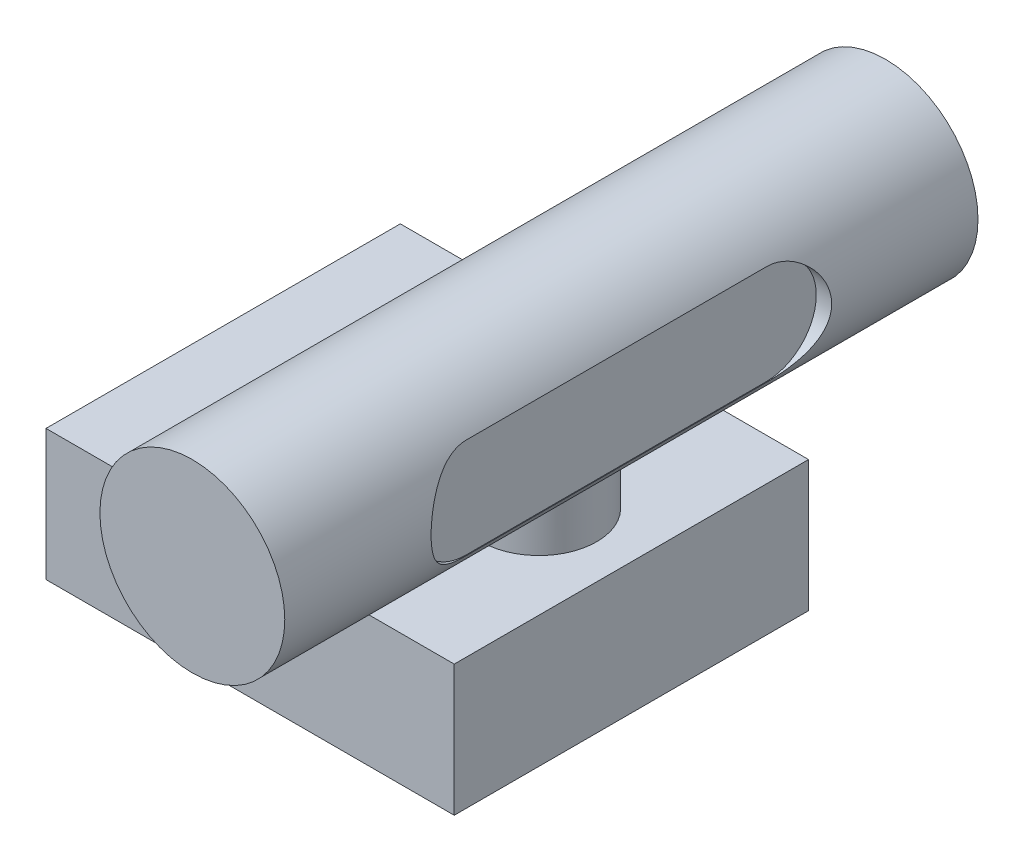
ISO-10303-21;
HEADER;
FILE_DESCRIPTION(('STEP AP214'),'2;1');
FILE_NAME('part.step','',(''),(''),'','','');
FILE_SCHEMA(('AUTOMOTIVE_DESIGN { 1 0 10303 214 1 1 1 1 }'));
ENDSEC;
DATA;
#1=APPLICATION_CONTEXT('core data for automotive mechanical design processes');
#2=APPLICATION_PROTOCOL_DEFINITION('international standard','automotive_design',2000,#1);
#3=PRODUCT_CONTEXT('',#1,'mechanical');
#4=PRODUCT('Part','Part','',(#3));
#5=PRODUCT_RELATED_PRODUCT_CATEGORY('part','',(#4));
#6=PRODUCT_DEFINITION_FORMATION('','',#4);
#7=PRODUCT_DEFINITION_CONTEXT('part definition',#1,'design');
#8=PRODUCT_DEFINITION('design','',#6,#7);
#9=PRODUCT_DEFINITION_SHAPE('','',#8);
#10=(LENGTH_UNIT() NAMED_UNIT(*) SI_UNIT(.MILLI.,.METRE.));
#11=(NAMED_UNIT(*) PLANE_ANGLE_UNIT() SI_UNIT($,.RADIAN.));
#12=(NAMED_UNIT(*) SI_UNIT($,.STERADIAN.) SOLID_ANGLE_UNIT());
#13=UNCERTAINTY_MEASURE_WITH_UNIT(LENGTH_MEASURE(1.E-05),#10,'distance_accuracy_value','');
#14=(GEOMETRIC_REPRESENTATION_CONTEXT(3) GLOBAL_UNCERTAINTY_ASSIGNED_CONTEXT((#13)) GLOBAL_UNIT_ASSIGNED_CONTEXT((#10,
#11,#12)) REPRESENTATION_CONTEXT('',''));
#15=CARTESIAN_POINT('',(0.,0.,0.));
#16=DIRECTION('',(0.,0.,1.));
#17=DIRECTION('',(1.,0.,0.));
#18=AXIS2_PLACEMENT_3D('',#15,#16,#17);
#19=CARTESIAN_POINT('',(0.,0.,45.));
#20=DIRECTION('',(0.,0.,-1.));
#21=DIRECTION('',(-1.,0.,0.));
#22=AXIS2_PLACEMENT_3D('',#19,#20,#21);
#23=CYLINDRICAL_SURFACE('',#22,12.);
#24=DIRECTION('',(0.,0.,-1.));
#25=VECTOR('',#24,1.);
#26=CARTESIAN_POINT('',(10.087120500916,-6.50000000000003,45.));
#27=LINE('',#26,#25);
#28=CARTESIAN_POINT('',(10.087120500916,-6.49999999999999,-19.5));
#29=VERTEX_POINT('',#28);
#30=CARTESIAN_POINT('',(10.087120500916,-6.5,19.5));
#31=VERTEX_POINT('',#30);
#32=EDGE_CURVE('E11',#29,#31,#27,.F.);
#33=ORIENTED_EDGE('',*,*,#32,.T.);
#34=CARTESIAN_POINT('',(10.087120500916,-6.5,19.5));
#35=CARTESIAN_POINT('',(10.087062195961,-6.50003429101187,19.6679437798922));
#36=CARTESIAN_POINT('',(10.0913128869651,-6.4934928137473,19.8358587697185));
#37=CARTESIAN_POINT('',(10.1079957775746,-6.46752293296288,20.1701586306483));
#38=CARTESIAN_POINT('',(10.1204218847057,-6.44810412578677,20.3365445476944));
#39=CARTESIAN_POINT('',(10.1529125251932,-6.39681365188614,20.6654764341207));
#40=CARTESIAN_POINT('',(10.1729259972036,-6.36502519331353,20.8280405217783));
#41=CARTESIAN_POINT('',(10.2198378122673,-6.28942794693309,21.1493435182866));
#42=CARTESIAN_POINT('',(10.2467371576266,-6.24561740912739,21.30808186658));
#43=CARTESIAN_POINT('',(10.30641682072,-6.14663265401189,21.6202942101693));
#44=CARTESIAN_POINT('',(10.3391794554295,-6.09149253336983,21.7737824255394));
#45=CARTESIAN_POINT('',(10.4096302308686,-5.97030238296009,22.0752487572257));
#46=CARTESIAN_POINT('',(10.4473202703357,-5.90424814491886,22.2232247210479));
#47=CARTESIAN_POINT('',(10.5663046508814,-5.69033017621695,22.6582627731183));
#48=CARTESIAN_POINT('',(10.6534583306845,-5.5267981501928,22.9361639977459));
#49=CARTESIAN_POINT('',(10.8437621641124,-5.14418462681988,23.4888680502809));
#50=CARTESIAN_POINT('',(10.9476439080116,-4.92125249592125,23.7607531485545));
#51=CARTESIAN_POINT('',(11.1021817500924,-4.55621786720434,24.1391432549429));
#52=CARTESIAN_POINT('',(11.1535054935014,-4.42936271280164,24.260420126194));
#53=CARTESIAN_POINT('',(11.2545808236235,-4.16584918666711,24.4926477193032));
#54=CARTESIAN_POINT('',(11.3043321637077,-4.02918928796179,24.6035968265254));
#55=CARTESIAN_POINT('',(11.4051031941459,-3.73493976173534,24.8232202801336));
#56=CARTESIAN_POINT('',(11.4558848945797,-3.57655454958828,24.9309399361234));
#57=CARTESIAN_POINT('',(11.5527946448066,-3.24991348786846,25.1324833201027));
#58=CARTESIAN_POINT('',(11.5989247072393,-3.08166195745685,25.2263130661814));
#59=CARTESIAN_POINT('',(11.6852194488674,-2.73629567186766,25.3991490337907));
#60=CARTESIAN_POINT('',(11.7253858837257,-2.55918354581627,25.47815961982));
#61=CARTESIAN_POINT('',(11.7985536228125,-2.19731412551113,25.6204241777237));
#62=CARTESIAN_POINT('',(11.8315558468563,-2.01255781632709,25.6836801724885));
#63=CARTESIAN_POINT('',(11.8870039787983,-1.65215993754409,25.7890939852802));
#64=CARTESIAN_POINT('',(11.910089170135,-1.47699526097865,25.8325472939671));
#65=CARTESIAN_POINT('',(11.9486789431556,-1.12284783377751,25.9048313956797));
#66=CARTESIAN_POINT('',(11.9641839001243,-0.943865272616932,25.9336629126088));
#67=CARTESIAN_POINT('',(11.9871523221345,-0.583712289314231,25.9762753835414));
#68=CARTESIAN_POINT('',(11.9946206025876,-0.402543243154034,25.990065350201));
#69=CARTESIAN_POINT('',(12.0013074341566,-0.0395400711660683,26.0024156424455));
#70=CARTESIAN_POINT('',(12.0005266113703,0.142294003139608,26.0009771238558));
#71=CARTESIAN_POINT('',(11.9912428191086,0.486465108070539,25.9838217733888));
#72=CARTESIAN_POINT('',(11.9835354089893,0.648899533835634,25.9695758829859));
#73=CARTESIAN_POINT('',(11.9616752161457,0.971868222053736,25.9289942657816));
#74=CARTESIAN_POINT('',(11.9475202841129,1.13240183253823,25.9026545074149));
#75=CARTESIAN_POINT('',(11.9131038825564,1.45035142395046,25.8382004725646));
#76=CARTESIAN_POINT('',(11.8928446550803,1.60776852695627,25.8000905190296));
#77=CARTESIAN_POINT('',(11.8466719124415,1.91861108230955,25.7124890255105));
#78=CARTESIAN_POINT('',(11.8207561932278,2.0720349525397,25.6629930485578));
#79=CARTESIAN_POINT('',(11.7635269793933,2.375614981164,25.5525058395535));
#80=CARTESIAN_POINT('',(11.732157367945,2.52571679943296,25.4913944136256));
#81=CARTESIAN_POINT('',(11.6648919840636,2.82013034052555,25.3585810450704));
#82=CARTESIAN_POINT('',(11.6289946923723,2.96444009830336,25.286875546223));
#83=CARTESIAN_POINT('',(11.5156113584435,3.38759401576816,25.0567278384945));
#84=CARTESIAN_POINT('',(11.4323977807755,3.65684690787994,24.8831867352693));
#85=CARTESIAN_POINT('',(11.2478737696275,4.1921084349449,24.4799712367777));
#86=CARTESIAN_POINT('',(11.1455802380817,4.45477024563127,24.2463038361287));
#87=CARTESIAN_POINT('',(10.9911726506922,4.81783578518724,23.8668304661678));
#88=CARTESIAN_POINT('',(10.9394942674054,4.93379547102318,23.7353763681101));
#89=CARTESIAN_POINT('',(10.8370445335834,5.15492882106028,23.4632602351618));
#90=CARTESIAN_POINT('',(10.786273344103,5.26010058548042,23.3225965855663));
#91=CARTESIAN_POINT('',(10.68275936451,5.46746786156484,23.0203931283512));
#92=CARTESIAN_POINT('',(10.6302136391154,5.56865733060802,22.8580941647339));
#93=CARTESIAN_POINT('',(10.5295140226574,5.7567974188211,22.5242310177048));
#94=CARTESIAN_POINT('',(10.4813581259231,5.84375455520089,22.3526711231499));
#95=CARTESIAN_POINT('',(10.3912927596917,6.00244504716518,22.0015379832887));
#96=CARTESIAN_POINT('',(10.3493697933328,6.07421144418174,21.821983179973));
#97=CARTESIAN_POINT('',(10.2734030523273,6.20183189840986,21.4557217981056));
#98=CARTESIAN_POINT('',(10.2393559889417,6.25769259961718,21.2690182427531));
#99=CARTESIAN_POINT('',(10.1902597652931,6.33719283673586,20.9516784620282));
#100=CARTESIAN_POINT('',(10.1726336937261,6.36540241521448,20.8225655640708));
#101=CARTESIAN_POINT('',(10.1420849623492,6.41396399838314,20.5623440926989));
#102=CARTESIAN_POINT('',(10.1291609672363,6.43431823394571,20.4312360968913));
#103=CARTESIAN_POINT('',(10.1083019955252,6.46704188766369,20.1671715910098));
#104=CARTESIAN_POINT('',(10.100384302387,6.47938364790594,20.0342102794404));
#105=CARTESIAN_POINT('',(10.0897802394188,6.49587186998622,19.7675030748144));
#106=CARTESIAN_POINT('',(10.0870966624316,6.50001395662372,19.6337568010666));
#107=CARTESIAN_POINT('',(10.087120500916,6.50000000000001,19.5));
#108=B_SPLINE_CURVE_WITH_KNOTS('',3,(#34,#35,#36,#37,#38,#39,#40,#41,#42,#43,#44,#45,#46,#47,
#48,#49,#50,#51,#52,#53,#54,#55,#56,#57,#58,#59,#60,#61,#62,#63,#64,#65,#66,#67,#68,#69,#70,#71,
#72,#73,#74,#75,#76,#77,#78,#79,#80,#81,#82,#83,#84,#85,#86,#87,#88,#89,#90,#91,#92,#93,#94,#95,
#96,#97,#98,#99,#100,#101,#102,#103,#104,#105,#106,#107),.UNSPECIFIED.,.F.,.F.,(4,2,2,2,2,2,2,2,
2,2,2,2,2,2,2,2,2,2,2,2,2,2,2,2,2,2,2,2,2,2,2,2,2,2,2,2,4),(0.,0.503604677776098,
1.00683448429647,1.50673610850658,2.00671053969548,2.50520176342487,3.00388564624337,
4.00211361113654,5.09721192166326,5.64530767865983,6.19348898118731,6.78721055923699,
7.380674137521,7.9739626551218,8.5671749551242,9.11225165070768,9.65730135770909,
10.2020242999496,10.7467058986108,11.2358454054532,11.7251480884742,12.2142712740493,
12.7035853877113,13.1982695015588,13.6931200499361,14.6822292767221,15.7758163216982,
16.3236183478857,16.8715166784088,17.4658072998479,18.059825020206,18.6525371028415,
19.245001238259,19.6446911184801,20.0442674053834,20.4452157401626,20.8463779562642),.UNSPECIFIED.);
#109=CARTESIAN_POINT('',(10.087120500916,6.5,19.5));
#110=VERTEX_POINT('',#109);
#111=EDGE_CURVE('E175',#31,#110,#108,.T.);
#112=ORIENTED_EDGE('',*,*,#111,.T.);
#113=DIRECTION('',(0.,0.,-1.));
#114=VECTOR('',#113,1.);
#115=CARTESIAN_POINT('',(10.087120500916,6.5,45.));
#116=LINE('',#115,#114);
#117=CARTESIAN_POINT('',(10.087120500916,6.5,-19.5));
#118=VERTEX_POINT('',#117);
#119=EDGE_CURVE('E47',#110,#118,#116,.T.);
#120=ORIENTED_EDGE('',*,*,#119,.T.);
#121=CARTESIAN_POINT('',(10.087120500916,6.5,-19.5));
#122=CARTESIAN_POINT('',(10.087062195961,6.50003429101187,-19.6679437798922));
#123=CARTESIAN_POINT('',(10.0913128869651,6.4934928137473,-19.8358587697185));
#124=CARTESIAN_POINT('',(10.1079957775746,6.46752293296288,-20.1701586306483));
#125=CARTESIAN_POINT('',(10.1204218847057,6.44810412578677,-20.3365445476944));
#126=CARTESIAN_POINT('',(10.1529125251932,6.39681365188614,-20.6654764341207));
#127=CARTESIAN_POINT('',(10.1729259972036,6.36502519331353,-20.8280405217782));
#128=CARTESIAN_POINT('',(10.2198378122673,6.28942794693309,-21.1493435182866));
#129=CARTESIAN_POINT('',(10.2467371576266,6.24561740912739,-21.30808186658));
#130=CARTESIAN_POINT('',(10.30641682072,6.14663265401189,-21.6202942101693));
#131=CARTESIAN_POINT('',(10.3391794554295,6.09149253336983,-21.7737824255394));
#132=CARTESIAN_POINT('',(10.4096302308686,5.97030238296009,-22.0752487572257));
#133=CARTESIAN_POINT('',(10.4473202703357,5.90424814491886,-22.2232247210478));
#134=CARTESIAN_POINT('',(10.5663046508814,5.69033017621695,-22.6582627731183));
#135=CARTESIAN_POINT('',(10.6534583306845,5.5267981501928,-22.9361639977459));
#136=CARTESIAN_POINT('',(10.8437621641124,5.14418462681989,-23.4888680502808));
#137=CARTESIAN_POINT('',(10.9476439080116,4.92125249592126,-23.7607531485545));
#138=CARTESIAN_POINT('',(11.1021817500924,4.55621786720434,-24.1391432549429));
#139=CARTESIAN_POINT('',(11.1535054935014,4.42936271280164,-24.2604201261939));
#140=CARTESIAN_POINT('',(11.2545808236235,4.16584918666712,-24.4926477193032));
#141=CARTESIAN_POINT('',(11.3043321637077,4.0291892879618,-24.6035968265254));
#142=CARTESIAN_POINT('',(11.4051031941459,3.73493976173536,-24.8232202801336));
#143=CARTESIAN_POINT('',(11.4558848945797,3.5765545495883,-24.9309399361234));
#144=CARTESIAN_POINT('',(11.5527946448066,3.24991348786848,-25.1324833201027));
#145=CARTESIAN_POINT('',(11.5989247072393,3.08166195745687,-25.2263130661814));
#146=CARTESIAN_POINT('',(11.6852194488674,2.73629567186768,-25.3991490337907));
#147=CARTESIAN_POINT('',(11.7253858837257,2.55918354581628,-25.47815961982));
#148=CARTESIAN_POINT('',(11.7985536228125,2.19731412551115,-25.6204241777237));
#149=CARTESIAN_POINT('',(11.8315558468563,2.0125578163271,-25.6836801724885));
#150=CARTESIAN_POINT('',(11.8870039787983,1.6521599375441,-25.7890939852802));
#151=CARTESIAN_POINT('',(11.910089170135,1.47699526097867,-25.8325472939671));
#152=CARTESIAN_POINT('',(11.9486789431556,1.12284783377753,-25.9048313956797));
#153=CARTESIAN_POINT('',(11.9641839001243,0.943865272616951,-25.9336629126087));
#154=CARTESIAN_POINT('',(11.9871523221345,0.583712289314251,-25.9762753835414));
#155=CARTESIAN_POINT('',(11.9946206025876,0.402543243154054,-25.990065350201));
#156=CARTESIAN_POINT('',(12.0013074341566,0.0395400711660886,-26.0024156424455));
#157=CARTESIAN_POINT('',(12.0005266113703,-0.142294003139588,-26.0009771238558));
#158=CARTESIAN_POINT('',(11.9912428191086,-0.486465108070518,-25.9838217733888));
#159=CARTESIAN_POINT('',(11.9835354089893,-0.648899533835612,-25.9695758829859));
#160=CARTESIAN_POINT('',(11.9616752161457,-0.971868222053715,-25.9289942657816));
#161=CARTESIAN_POINT('',(11.947520284113,-1.13240183253821,-25.9026545074149));
#162=CARTESIAN_POINT('',(11.9131038825564,-1.45035142395044,-25.8382004725646));
#163=CARTESIAN_POINT('',(11.8928446550803,-1.60776852695625,-25.8000905190295));
#164=CARTESIAN_POINT('',(11.8466719124415,-1.91861108230953,-25.7124890255105));
#165=CARTESIAN_POINT('',(11.8207561932278,-2.07203495253968,-25.6629930485578));
#166=CARTESIAN_POINT('',(11.7635269793933,-2.37561498116398,-25.5525058395535));
#167=CARTESIAN_POINT('',(11.732157367945,-2.52571679943294,-25.4913944136256));
#168=CARTESIAN_POINT('',(11.6648919840636,-2.82013034052553,-25.3585810450704));
#169=CARTESIAN_POINT('',(11.6289946923723,-2.96444009830334,-25.286875546223));
#170=CARTESIAN_POINT('',(11.5156113584435,-3.38759401576815,-25.0567278384945));
#171=CARTESIAN_POINT('',(11.4323977807755,-3.65684690787992,-24.8831867352693));
#172=CARTESIAN_POINT('',(11.2478737696275,-4.19210843494488,-24.4799712367777));
#173=CARTESIAN_POINT('',(11.1455802380817,-4.45477024563125,-24.2463038361287));
#174=CARTESIAN_POINT('',(10.9911726506922,-4.81783578518722,-23.8668304661678));
#175=CARTESIAN_POINT('',(10.9394942674054,-4.93379547102316,-23.7353763681101));
#176=CARTESIAN_POINT('',(10.8370445335834,-5.15492882106026,-23.4632602351618));
#177=CARTESIAN_POINT('',(10.786273344103,-5.2601005854804,-23.3225965855663));
#178=CARTESIAN_POINT('',(10.68275936451,-5.46746786156481,-23.0203931283512));
#179=CARTESIAN_POINT('',(10.6302136391154,-5.568657330608,-22.8580941647339));
#180=CARTESIAN_POINT('',(10.5295140226575,-5.75679741882108,-22.5242310177048));
#181=CARTESIAN_POINT('',(10.4813581259232,-5.84375455520086,-22.3526711231499));
#182=CARTESIAN_POINT('',(10.3912927596917,-6.00244504716516,-22.0015379832887));
#183=CARTESIAN_POINT('',(10.3493697933328,-6.07421144418171,-21.821983179973));
#184=CARTESIAN_POINT('',(10.2734030523273,-6.20183189840984,-21.4557217981056));
#185=CARTESIAN_POINT('',(10.2393559889418,-6.25769259961716,-21.2690182427531));
#186=CARTESIAN_POINT('',(10.1902597652931,-6.33719283673584,-20.9516784620282));
#187=CARTESIAN_POINT('',(10.1726336937261,-6.36540241521445,-20.8225655640708));
#188=CARTESIAN_POINT('',(10.1420849623492,-6.41396399838312,-20.5623440926989));
#189=CARTESIAN_POINT('',(10.1291609672363,-6.43431823394569,-20.4312360968913));
#190=CARTESIAN_POINT('',(10.1083019955252,-6.46704188766367,-20.1671715910098));
#191=CARTESIAN_POINT('',(10.100384302387,-6.47938364790592,-20.0342102794405));
#192=CARTESIAN_POINT('',(10.0897802394188,-6.4958718699862,-19.7675030748144));
#193=CARTESIAN_POINT('',(10.0870966624316,-6.5000139566237,-19.6337568010666));
#194=CARTESIAN_POINT('',(10.087120500916,-6.49999999999999,-19.5));
#195=B_SPLINE_CURVE_WITH_KNOTS('',3,(#121,#122,#123,#124,#125,#126,#127,#128,#129,#130,#131,
#132,#133,#134,#135,#136,#137,#138,#139,#140,#141,#142,#143,#144,#145,#146,#147,#148,#149,#150,
#151,#152,#153,#154,#155,#156,#157,#158,#159,#160,#161,#162,#163,#164,#165,#166,#167,#168,#169,
#170,#171,#172,#173,#174,#175,#176,#177,#178,#179,#180,#181,#182,#183,#184,#185,#186,#187,#188,
#189,#190,#191,#192,#193,#194),.UNSPECIFIED.,.F.,.F.,(4,2,2,2,2,2,2,2,2,2,2,2,2,2,2,2,2,2,2,2,2,
2,2,2,2,2,2,2,2,2,2,2,2,2,2,2,4),(0.,0.503604677776094,1.00683448429646,1.50673610850657,
2.00671053969547,2.50520176342486,3.00388564624335,4.00211361113653,5.09721192166324,
5.64530767865981,6.19348898118729,6.78721055923696,7.38067413752098,7.97396265512178,
8.56717495512417,9.11225165070765,9.65730135770906,10.2020242999495,10.7467058986108,
11.2358454054531,11.7251480884741,12.2142712740493,12.7035853877113,13.1982695015588,
13.6931200499361,14.6822292767221,15.7758163216982,16.3236183478856,16.8715166784088,
17.4658072998478,18.059825020206,18.6525371028414,19.2450012382589,19.64469111848,
20.0442674053834,20.4452157401625,20.8463779562642),.UNSPECIFIED.);
#196=EDGE_CURVE('E54',#118,#29,#195,.T.);
#197=ORIENTED_EDGE('',*,*,#196,.T.);
#198=EDGE_LOOP('',(#33,#112,#120,#197));
#199=FACE_BOUND('',#198,.T.);
#200=CARTESIAN_POINT('',(0.,-12.,7.5));
#201=CARTESIAN_POINT('',(0.190619566647108,-11.9999995532122,7.49999956062287));
#202=CARTESIAN_POINT('',(0.381248925898922,-11.995447915242,7.4927231835923));
#203=CARTESIAN_POINT('',(0.761048560647169,-11.9773524315033,7.46371878846394));
#204=CARTESIAN_POINT('',(0.950218165967977,-11.9638046782917,7.44198449059235));
#205=CARTESIAN_POINT('',(1.32581871670309,-11.9280277375079,7.38433184840932));
#206=CARTESIAN_POINT('',(1.51224542264306,-11.9057863310929,7.34839353970666));
#207=CARTESIAN_POINT('',(1.88082067150569,-11.8531509871465,7.26280430615644));
#208=CARTESIAN_POINT('',(2.06296736941036,-11.8227536014107,7.21314758114044));
#209=CARTESIAN_POINT('',(2.42075316021948,-11.7546985753846,7.1010499589802));
#210=CARTESIAN_POINT('',(2.59642222708668,-11.7170812683578,7.038679968268));
#211=CARTESIAN_POINT('',(2.94138219664415,-11.6352788302721,6.9016472221109));
#212=CARTESIAN_POINT('',(3.11067059715781,-11.5910911555539,6.82697970457752));
#213=CARTESIAN_POINT('',(3.44191201359288,-11.4970802999278,6.66611709142441));
#214=CARTESIAN_POINT('',(3.60386938499648,-11.4472605283515,6.57992896398388));
#215=CARTESIAN_POINT('',(3.91994964834574,-11.342916021806,6.39667102111854));
#216=CARTESIAN_POINT('',(4.07406961537993,-11.2883895504837,6.29959718585273));
#217=CARTESIAN_POINT('',(4.54766802657202,-11.1102668782099,5.97679245588143));
#218=CARTESIAN_POINT('',(4.8519991899271,-10.9797949370995,5.73223066828649));
#219=CARTESIAN_POINT('',(5.41799653038589,-10.7118437374653,5.20061839535876));
#220=CARTESIAN_POINT('',(5.67960436893886,-10.5743552283597,4.91351081693151));
#221=CARTESIAN_POINT('',(6.05325915580741,-10.3625451082314,4.43357503251927));
#222=CARTESIAN_POINT('',(6.18110853656476,-10.2865835551074,4.25357027614364));
#223=CARTESIAN_POINT('',(6.42112135963148,-10.1384942082844,3.88177247269946));
#224=CARTESIAN_POINT('',(6.53328186402993,-10.0663671341963,3.68997722738876));
#225=CARTESIAN_POINT('',(6.74080013377373,-9.92860091052941,3.29563278102502));
#226=CARTESIAN_POINT('',(6.83618054185991,-9.86295307136382,3.09309855904906));
#227=CARTESIAN_POINT('',(7.00920436732312,-9.74075363704153,2.67797731599975));
#228=CARTESIAN_POINT('',(7.08685512557526,-9.68419828006712,2.46539449966513));
#229=CARTESIAN_POINT('',(7.20551702719017,-9.59606582071377,2.08779843889696));
#230=CARTESIAN_POINT('',(7.25080787343436,-9.56181442242543,1.92474346491032));
#231=CARTESIAN_POINT('',(7.33048458047324,-9.50086929163898,1.59461874743159));
#232=CARTESIAN_POINT('',(7.36487307586588,-9.47417373340849,1.4275499844023));
#233=CARTESIAN_POINT('',(7.42225835643841,-9.42928478595652,1.09053342330117));
#234=CARTESIAN_POINT('',(7.44526842827916,-9.41108148168611,0.920589223971795));
#235=CARTESIAN_POINT('',(7.47960613066698,-9.38381461834733,0.578783778209181));
#236=CARTESIAN_POINT('',(7.49093360113989,-9.37475118451284,0.406922505540951));
#237=CARTESIAN_POINT('',(7.50173090676298,-9.36611354907678,0.0621309610981031));
#238=CARTESIAN_POINT('',(7.50116931589014,-9.36656449656235,-0.11080093560946));
#239=CARTESIAN_POINT('',(7.48812103711906,-9.37699905806399,-0.455921847780588));
#240=CARTESIAN_POINT('',(7.47563428757732,-9.38698272135655,-0.628110859399411));
#241=CARTESIAN_POINT('',(7.43893405278703,-9.41609285729433,-0.970529572744749));
#242=CARTESIAN_POINT('',(7.4147147460026,-9.43522386866845,-1.1407582588108));
#243=CARTESIAN_POINT('',(7.35490433989438,-9.48192052661057,-1.47808730126839));
#244=CARTESIAN_POINT('',(7.31930854410361,-9.50948965642168,-1.6451863354584));
#245=CARTESIAN_POINT('',(7.23818043219761,-9.57137815533325,-1.97137700795015));
#246=CARTESIAN_POINT('',(7.19290000268538,-9.60552455541434,-2.13056452063443));
#247=CARTESIAN_POINT('',(7.09241917276094,-9.67995329857146,-2.44432958374558));
#248=CARTESIAN_POINT('',(7.03721554380122,-9.7202376379955,-2.59890561466943));
#249=CARTESIAN_POINT('',(6.8574608663731,-9.84870189266919,-3.05481861109239));
#250=CARTESIAN_POINT('',(6.71872516152539,-9.94452556666171,-3.3485021673929));
#251=CARTESIAN_POINT('',(6.37765615740406,-10.1673105160437,-3.96507783200828));
#252=CARTESIAN_POINT('',(6.16828382492785,-10.2967445695704,-4.28317768897413));
#253=CARTESIAN_POINT('',(5.82110436815636,-10.4944084445826,-4.73293577578045));
#254=CARTESIAN_POINT('',(5.69974888955961,-10.5609357371722,-4.87839375835788));
#255=CARTESIAN_POINT('',(5.44629756807103,-10.6938436866563,-5.15981566173415));
#256=CARTESIAN_POINT('',(5.31419975316373,-10.7602243143192,-5.29577783079289));
#257=CARTESIAN_POINT('',(5.01697539524734,-10.9023575769586,-5.57932245078891));
#258=CARTESIAN_POINT('',(4.85000013375938,-10.9778438704741,-5.7251060695979));
#259=CARTESIAN_POINT('',(4.50276237941299,-11.1247766388623,-6.00203481743236));
#260=CARTESIAN_POINT('',(4.32250480780411,-11.1962245928206,-6.13318532336229));
#261=CARTESIAN_POINT('',(3.94942238954631,-11.3332055029809,-6.37981673216257));
#262=CARTESIAN_POINT('',(3.75659736956911,-11.3987383775733,-6.49529741884949));
#263=CARTESIAN_POINT('',(3.35941102011903,-11.5220474859631,-6.70933906240218));
#264=CARTESIAN_POINT('',(3.15505106313042,-11.5798246398229,-6.80790202660708));
#265=CARTESIAN_POINT('',(2.74743256999426,-11.6830389587748,-6.98197970605148));
#266=CARTESIAN_POINT('',(2.54470941441903,-11.7289736974915,-7.05845099174998));
#267=CARTESIAN_POINT('',(2.13157938326148,-11.811041661072,-7.19399873035992));
#268=CARTESIAN_POINT('',(1.9211726504367,-11.8471750679352,-7.25307550626913));
#269=CARTESIAN_POINT('',(1.49472673132593,-11.9084901823747,-7.35280110160717));
#270=CARTESIAN_POINT('',(1.27869447874659,-11.9336847527883,-7.39347156717866));
#271=CARTESIAN_POINT('',(0.842873048507556,-11.9723594878915,-7.45573552395234));
#272=CARTESIAN_POINT('',(0.623084519154828,-11.9858416536503,-7.47733227391738));
#273=CARTESIAN_POINT('',(0.214858495803906,-11.9995479572045,-7.49928016887094));
#274=CARTESIAN_POINT('',(0.0266149967578218,-12.0014443611508,-7.5023112490872));
#275=CARTESIAN_POINT('',(-0.349446670593417,-11.9963842846165,-7.49421433890599));
#276=CARTESIAN_POINT('',(-0.537264859851303,-11.9894282501906,-7.48308706191694));
#277=CARTESIAN_POINT('',(-0.910991756077105,-11.9668350807337,-7.44683433026539));
#278=CARTESIAN_POINT('',(-1.09690064715817,-11.9511987908968,-7.42171023846835));
#279=CARTESIAN_POINT('',(-1.46545452962524,-11.9116245112255,-7.35781397404302));
#280=CARTESIAN_POINT('',(-1.64809946338587,-11.8876863749734,-7.31904156070241));
#281=CARTESIAN_POINT('',(-2.00176418592843,-11.8331598910823,-7.23013537493481));
#282=CARTESIAN_POINT('',(-2.17295837758272,-11.8028710214065,-7.18050993380237));
#283=CARTESIAN_POINT('',(-2.51025641717805,-11.7357674103149,-7.06966547602218));
#284=CARTESIAN_POINT('',(-2.67635860381726,-11.698950565128,-7.00844272147128));
#285=CARTESIAN_POINT('',(-3.16565893091192,-11.5797670117332,-6.80827406213982));
#286=CARTESIAN_POINT('',(-3.48012032541321,-11.4886240896565,-6.65275897990267));
#287=CARTESIAN_POINT('',(-4.11054985865833,-11.2793971868224,-6.28489955859526));
#288=CARTESIAN_POINT('',(-4.42346611353792,-11.1595224251757,-6.06840341415093));
#289=CARTESIAN_POINT('',(-5.01087155236142,-10.9084016454844,-5.59321195175993));
#290=CARTESIAN_POINT('',(-5.28531740986528,-10.7771430716294,-5.33446975361772));
#291=CARTESIAN_POINT('',(-5.68378630400867,-10.5698357784905,-4.89805198650426));
#292=CARTESIAN_POINT('',(-5.82200158437924,-10.4941439247455,-4.73293527678662));
#293=CARTESIAN_POINT('',(-6.08406927589425,-10.3444135271725,-4.39096063880098));
#294=CARTESIAN_POINT('',(-6.20791925699363,-10.2703752647726,-4.2141007319783));
#295=CARTESIAN_POINT('',(-6.55667613792569,-10.0540805552584,-3.66699132428376));
#296=CARTESIAN_POINT('',(-6.75926254336211,-9.91738690530566,-3.27969589310443));
#297=CARTESIAN_POINT('',(-7.06112141327047,-9.70399624372505,-2.55173809206709));
#298=CARTESIAN_POINT('',(-7.17314884432512,-9.62072912208878,-2.21831881968694));
#299=CARTESIAN_POINT('',(-7.30584216978485,-9.51985737912651,-1.70469217490702));
#300=CARTESIAN_POINT('',(-7.34417548991675,-9.49024381108569,-1.5312901554647));
#301=CARTESIAN_POINT('',(-7.40858885177235,-9.44004790047219,-1.18089425546506));
#302=CARTESIAN_POINT('',(-7.43466893135976,-9.41946552999222,-1.00390038600868));
#303=CARTESIAN_POINT('',(-7.47425009074844,-9.38808969726656,-0.646594908378802));
#304=CARTESIAN_POINT('',(-7.48767722035203,-9.37735379234093,-0.466270000151808));
#305=CARTESIAN_POINT('',(-7.50144825996218,-9.36634161050915,-0.104796839590294));
#306=CARTESIAN_POINT('',(-7.50179222766206,-9.36606528747898,0.0763514091099858));
#307=CARTESIAN_POINT('',(-7.48938795053318,-9.37598681103331,0.43796062606584));
#308=CARTESIAN_POINT('',(-7.47663572822038,-9.38618783972656,0.618421368804315));
#309=CARTESIAN_POINT('',(-7.43826656384522,-9.41662284471166,0.977100369726604));
#310=CARTESIAN_POINT('',(-7.41264980328658,-9.43685667945219,1.15531865951247));
#311=CARTESIAN_POINT('',(-7.35155602831879,-9.48451321304134,1.49391440512473));
#312=CARTESIAN_POINT('',(-7.31704438995435,-9.51122188774388,1.65456876019928));
#313=CARTESIAN_POINT('',(-7.23793713973318,-9.57155864008264,1.97207055018779));
#314=CARTESIAN_POINT('',(-7.19333816513426,-9.60518902482184,2.12891669623452));
#315=CARTESIAN_POINT('',(-7.04509282162154,-9.71503069388836,2.59266083641481));
#316=CARTESIAN_POINT('',(-6.92696853747386,-9.80021663951181,2.89292469964286));
#317=CARTESIAN_POINT('',(-6.63615711116348,-9.99983798059089,3.51362117995867));
#318=CARTESIAN_POINT('',(-6.45804656638933,-10.1167224681131,3.83068049941861));
#319=CARTESIAN_POINT('',(-6.05997310048792,-10.3600737557563,4.43365151218988));
#320=CARTESIAN_POINT('',(-5.83997634289753,-10.4865482528165,4.71953772760669));
#321=CARTESIAN_POINT('',(-5.45732091848675,-10.6885004223508,5.14919095825918));
#322=CARTESIAN_POINT('',(-5.30696622992364,-10.7641240975658,5.30403485027451));
#323=CARTESIAN_POINT('',(-4.99294748716707,-10.9133244940505,5.60063284000905));
#324=CARTESIAN_POINT('',(-4.82928739500892,-10.9869018159809,5.74239080775254));
#325=CARTESIAN_POINT('',(-4.48911825376835,-11.1302253980356,6.01206860989174));
#326=CARTESIAN_POINT('',(-4.31259866081967,-11.1999684302129,6.13997686995645));
#327=CARTESIAN_POINT('',(-3.9475369053171,-11.333787591106,6.38081225962829));
#328=CARTESIAN_POINT('',(-3.75899354736885,-11.3978631548499,6.4937378962246));
#329=CARTESIAN_POINT('',(-3.37043695923499,-11.518751359675,6.70365657542925));
#330=CARTESIAN_POINT('',(-3.17040034834194,-11.5755483775269,6.80061546877389));
#331=CARTESIAN_POINT('',(-2.76058605833698,-11.6800617043073,6.97702584882795));
#332=CARTESIAN_POINT('',(-2.55081409067013,-11.7277832558181,7.05648744733214));
#333=CARTESIAN_POINT('',(-2.12362476506203,-11.8125995309597,7.1965691289623));
#334=CARTESIAN_POINT('',(-1.9062297844023,-11.8497228417076,7.25723993564142));
#335=CARTESIAN_POINT('',(-1.46536861971848,-11.912270430911,7.35892660266932));
#336=CARTESIAN_POINT('',(-1.24190704258899,-11.9377033375034,7.39995695963793));
#337=CARTESIAN_POINT('',(-0.848562063043676,-11.9711490805024,7.45377224279969));
#338=CARTESIAN_POINT('',(-0.67951807108774,-11.9819481326886,7.47108825512896));
#339=CARTESIAN_POINT('',(-0.340318699377054,-11.99637401382,7.49420268628224));
#340=CARTESIAN_POINT('',(-0.170163251486901,-12.0000003988408,7.50000039222543));
#341=CARTESIAN_POINT('',(0.,-12.,7.5));
#342=B_SPLINE_CURVE_WITH_KNOTS('',3,(#200,#201,#202,#203,#204,#205,#206,#207,#208,#209,#210,
#211,#212,#213,#214,#215,#216,#217,#218,#219,#220,#221,#222,#223,#224,#225,#226,#227,#228,#229,
#230,#231,#232,#233,#234,#235,#236,#237,#238,#239,#240,#241,#242,#243,#244,#245,#246,#247,#248,
#249,#250,#251,#252,#253,#254,#255,#256,#257,#258,#259,#260,#261,#262,#263,#264,#265,#266,#267,
#268,#269,#270,#271,#272,#273,#274,#275,#276,#277,#278,#279,#280,#281,#282,#283,#284,#285,#286,
#287,#288,#289,#290,#291,#292,#293,#294,#295,#296,#297,#298,#299,#300,#301,#302,#303,#304,#305,
#306,#307,#308,#309,#310,#311,#312,#313,#314,#315,#316,#317,#318,#319,#320,#321,#322,#323,#324,
#325,#326,#327,#328,#329,#330,#331,#332,#333,#334,#335,#336,#337,#338,#339,#340,#341),
.UNSPECIFIED.,.T.,.F.,(4,2,2,2,2,2,2,2,2,2,2,2,2,2,2,2,2,2,2,2,2,2,2,2,2,2,2,2,2,2,2,2,2,2,2,2,
2,2,2,2,2,2,2,2,2,2,2,2,2,2,2,2,2,2,2,2,2,2,2,2,2,2,2,2,2,2,2,2,2,2,4),(0.,0.571684220754833,
1.14361691387166,1.71635635993984,2.28933833274585,2.85920797039841,3.42929880520962,
3.9990463708775,4.56900502836932,5.79886592732075,7.03039240362473,7.7301319742759,
8.43000240377167,9.12892107448338,9.82754983442604,10.345027076987,10.8623791735569,
11.3791257196195,11.8958793460121,12.4139990629366,12.9321214581394,13.450501202386,
13.9690952223073,14.4755594526396,14.9821887621071,15.9949424690231,17.1968854158095,
17.7988072666957,18.4008398654092,19.1024718979048,19.8038452622782,20.505228301932,
21.2065280627433,21.8699929818264,22.5334455802851,23.1961159064198,23.8586729927718,
24.4227858527252,24.9868702894006,25.5508998109492,26.1149392806566,26.6567358392628,
27.1987073210987,28.2818149849288,29.4742509086539,30.6680191788819,31.3520645796716,
32.0362255258672,33.402336625859,34.482079412967,35.0216125640688,35.5611440479487,
36.1038096169927,36.6464727930236,37.1893008317085,37.732121211934,38.2310264669269,
38.7300982841243,39.7277529807496,40.8698395241618,42.0128526111692,42.6982779600725,
43.3834999478439,44.069290232793,44.7551488051505,45.442455740093,46.1293644275519,
46.814402390522,47.4989339441928,48.0092363614772,48.5195703609637),.UNSPECIFIED.);
#343=CARTESIAN_POINT('',(0.,-12.,7.5));
#344=VERTEX_POINT('',#343);
#345=EDGE_CURVE('E171',#344,#344,#342,.T.);
#346=ORIENTED_EDGE('',*,*,#345,.T.);
#347=EDGE_LOOP('',(#346));
#348=FACE_BOUND('',#347,.T.);
#349=CARTESIAN_POINT('',(0.,0.,45.));
#350=DIRECTION('',(0.,0.,1.));
#351=DIRECTION('',(1.,0.,0.));
#352=AXIS2_PLACEMENT_3D('',#349,#350,#351);
#353=CIRCLE('',#352,12.);
#354=CARTESIAN_POINT('',(12.,0.,45.));
#355=VERTEX_POINT('',#354);
#356=EDGE_CURVE('E172',#355,#355,#353,.T.);
#357=ORIENTED_EDGE('',*,*,#356,.F.);
#358=EDGE_LOOP('',(#357));
#359=FACE_BOUND('',#358,.T.);
#360=CARTESIAN_POINT('',(0.,0.,-45.));
#361=DIRECTION('',(0.,0.,1.));
#362=DIRECTION('',(1.,0.,0.));
#363=AXIS2_PLACEMENT_3D('',#360,#361,#362);
#364=CIRCLE('',#363,12.);
#365=CARTESIAN_POINT('',(12.,0.,-45.));
#366=VERTEX_POINT('',#365);
#367=EDGE_CURVE('E176',#366,#366,#364,.T.);
#368=ORIENTED_EDGE('',*,*,#367,.T.);
#369=EDGE_LOOP('',(#368));
#370=FACE_BOUND('',#369,.T.);
#371=ADVANCED_FACE('F39',(#199,#348,#359,#370),#23,.T.);
#372=CARTESIAN_POINT('',(0.,0.,45.));
#373=DIRECTION('',(0.,0.,1.));
#374=DIRECTION('',(1.,0.,0.));
#375=AXIS2_PLACEMENT_3D('',#372,#373,#374);
#376=PLANE('',#375);
#377=ORIENTED_EDGE('',*,*,#356,.T.);
#378=EDGE_LOOP('',(#377));
#379=FACE_BOUND('',#378,.T.);
#380=ADVANCED_FACE('F200',(#379),#376,.T.);
#381=CARTESIAN_POINT('',(0.,0.,-45.));
#382=DIRECTION('',(0.,0.,1.));
#383=DIRECTION('',(1.,0.,0.));
#384=AXIS2_PLACEMENT_3D('',#381,#382,#383);
#385=PLANE('',#384);
#386=ORIENTED_EDGE('',*,*,#367,.F.);
#387=EDGE_LOOP('',(#386));
#388=FACE_BOUND('',#387,.T.);
#389=ADVANCED_FACE('F197',(#388),#385,.F.);
#390=CARTESIAN_POINT('',(0.,-16.,0.));
#391=DIRECTION('',(0.,1.,0.));
#392=DIRECTION('',(0.,0.,1.));
#393=AXIS2_PLACEMENT_3D('',#390,#391,#392);
#394=CYLINDRICAL_SURFACE('',#393,7.5);
#395=CARTESIAN_POINT('',(0.,-16.,0.));
#396=DIRECTION('',(0.,1.,0.));
#397=DIRECTION('',(0.,0.,1.));
#398=AXIS2_PLACEMENT_3D('',#395,#396,#397);
#399=CIRCLE('',#398,7.5);
#400=CARTESIAN_POINT('',(0.,-16.,7.5));
#401=VERTEX_POINT('',#400);
#402=EDGE_CURVE('E168',#401,#401,#399,.T.);
#403=ORIENTED_EDGE('',*,*,#402,.T.);
#404=EDGE_LOOP('',(#403));
#405=FACE_BOUND('',#404,.T.);
#406=ORIENTED_EDGE('',*,*,#345,.F.);
#407=EDGE_LOOP('',(#406));
#408=FACE_BOUND('',#407,.T.);
#409=ADVANCED_FACE('F191',(#405,#408),#394,.T.);
#410=CARTESIAN_POINT('',(12.,-33.,-23.));
#411=DIRECTION('',(-1.,0.,0.));
#412=DIRECTION('',(0.,0.,1.));
#413=AXIS2_PLACEMENT_3D('',#410,#411,#412);
#414=PLANE('',#413);
#415=DIRECTION('',(0.,0.,1.));
#416=VECTOR('',#415,1.);
#417=CARTESIAN_POINT('',(12.,-16.,-23.));
#418=LINE('',#417,#416);
#419=CARTESIAN_POINT('',(12.,-16.,-23.));
#420=VERTEX_POINT('',#419);
#421=CARTESIAN_POINT('',(12.,-16.,23.));
#422=VERTEX_POINT('',#421);
#423=EDGE_CURVE('E141',#420,#422,#418,.T.);
#424=ORIENTED_EDGE('',*,*,#423,.T.);
#425=DIRECTION('',(0.,1.,0.));
#426=VECTOR('',#425,1.);
#427=CARTESIAN_POINT('',(12.,-33.,23.));
#428=LINE('',#427,#426);
#429=CARTESIAN_POINT('',(12.,-33.,23.));
#430=VERTEX_POINT('',#429);
#431=EDGE_CURVE('E166',#430,#422,#428,.T.);
#432=ORIENTED_EDGE('',*,*,#431,.F.);
#433=DIRECTION('',(0.,0.,1.));
#434=VECTOR('',#433,1.);
#435=CARTESIAN_POINT('',(12.,-33.,-23.));
#436=LINE('',#435,#434);
#437=CARTESIAN_POINT('',(12.,-33.,-23.));
#438=VERTEX_POINT('',#437);
#439=EDGE_CURVE('E146',#438,#430,#436,.T.);
#440=ORIENTED_EDGE('',*,*,#439,.F.);
#441=DIRECTION('',(0.,1.,0.));
#442=VECTOR('',#441,1.);
#443=CARTESIAN_POINT('',(12.,-33.,-23.));
#444=LINE('',#443,#442);
#445=EDGE_CURVE('E152',#438,#420,#444,.T.);
#446=ORIENTED_EDGE('',*,*,#445,.T.);
#447=EDGE_LOOP('',(#424,#432,#440,#446));
#448=FACE_BOUND('',#447,.T.);
#449=ADVANCED_FACE('F196',(#448),#414,.F.);
#450=CARTESIAN_POINT('',(-41.,-33.,23.));
#451=DIRECTION('',(0.,0.,-1.));
#452=DIRECTION('',(-1.,0.,0.));
#453=AXIS2_PLACEMENT_3D('',#450,#451,#452);
#454=PLANE('',#453);
#455=DIRECTION('',(-1.,0.,0.));
#456=VECTOR('',#455,1.);
#457=CARTESIAN_POINT('',(-41.,-16.,23.));
#458=LINE('',#457,#456);
#459=CARTESIAN_POINT('',(-41.,-16.,23.));
#460=VERTEX_POINT('',#459);
#461=EDGE_CURVE('E155',#422,#460,#458,.T.);
#462=ORIENTED_EDGE('',*,*,#461,.T.);
#463=DIRECTION('',(0.,1.,0.));
#464=VECTOR('',#463,1.);
#465=CARTESIAN_POINT('',(-41.,-33.,23.));
#466=LINE('',#465,#464);
#467=CARTESIAN_POINT('',(-41.,-33.,23.));
#468=VERTEX_POINT('',#467);
#469=EDGE_CURVE('E163',#468,#460,#466,.T.);
#470=ORIENTED_EDGE('',*,*,#469,.F.);
#471=DIRECTION('',(-1.,0.,0.));
#472=VECTOR('',#471,1.);
#473=CARTESIAN_POINT('',(-41.,-33.,23.));
#474=LINE('',#473,#472);
#475=EDGE_CURVE('E92',#430,#468,#474,.T.);
#476=ORIENTED_EDGE('',*,*,#475,.F.);
#477=ORIENTED_EDGE('',*,*,#431,.T.);
#478=EDGE_LOOP('',(#462,#470,#476,#477));
#479=FACE_BOUND('',#478,.T.);
#480=ADVANCED_FACE('F244',(#479),#454,.F.);
#481=CARTESIAN_POINT('',(-41.,-33.,-23.));
#482=DIRECTION('',(1.,0.,0.));
#483=DIRECTION('',(0.,0.,-1.));
#484=AXIS2_PLACEMENT_3D('',#481,#482,#483);
#485=PLANE('',#484);
#486=DIRECTION('',(0.,0.,-1.));
#487=VECTOR('',#486,1.);
#488=CARTESIAN_POINT('',(-41.,-16.,-23.));
#489=LINE('',#488,#487);
#490=CARTESIAN_POINT('',(-41.,-16.,-23.));
#491=VERTEX_POINT('',#490);
#492=EDGE_CURVE('E157',#460,#491,#489,.T.);
#493=ORIENTED_EDGE('',*,*,#492,.T.);
#494=DIRECTION('',(0.,1.,0.));
#495=VECTOR('',#494,1.);
#496=CARTESIAN_POINT('',(-41.,-33.,-23.));
#497=LINE('',#496,#495);
#498=CARTESIAN_POINT('',(-41.,-33.,-23.));
#499=VERTEX_POINT('',#498);
#500=EDGE_CURVE('E161',#499,#491,#497,.T.);
#501=ORIENTED_EDGE('',*,*,#500,.F.);
#502=DIRECTION('',(0.,0.,-1.));
#503=VECTOR('',#502,1.);
#504=CARTESIAN_POINT('',(-41.,-33.,-23.));
#505=LINE('',#504,#503);
#506=EDGE_CURVE('E149',#468,#499,#505,.T.);
#507=ORIENTED_EDGE('',*,*,#506,.F.);
#508=ORIENTED_EDGE('',*,*,#469,.T.);
#509=EDGE_LOOP('',(#493,#501,#507,#508));
#510=FACE_BOUND('',#509,.T.);
#511=ADVANCED_FACE('F242',(#510),#485,.F.);
#512=CARTESIAN_POINT('',(-41.,-33.,-23.));
#513=DIRECTION('',(0.,0.,1.));
#514=DIRECTION('',(1.,0.,0.));
#515=AXIS2_PLACEMENT_3D('',#512,#513,#514);
#516=PLANE('',#515);
#517=DIRECTION('',(1.,0.,0.));
#518=VECTOR('',#517,1.);
#519=CARTESIAN_POINT('',(-41.,-16.,-23.));
#520=LINE('',#519,#518);
#521=EDGE_CURVE('E84',#491,#420,#520,.T.);
#522=ORIENTED_EDGE('',*,*,#521,.T.);
#523=ORIENTED_EDGE('',*,*,#445,.F.);
#524=DIRECTION('',(1.,0.,0.));
#525=VECTOR('',#524,1.);
#526=CARTESIAN_POINT('',(-41.,-33.,-23.));
#527=LINE('',#526,#525);
#528=EDGE_CURVE('E63',#499,#438,#527,.T.);
#529=ORIENTED_EDGE('',*,*,#528,.F.);
#530=ORIENTED_EDGE('',*,*,#500,.T.);
#531=EDGE_LOOP('',(#522,#523,#529,#530));
#532=FACE_BOUND('',#531,.T.);
#533=ADVANCED_FACE('F237',(#532),#516,.F.);
#534=CARTESIAN_POINT('',(0.,-33.,0.));
#535=DIRECTION('',(0.,1.,0.));
#536=DIRECTION('',(0.,0.,1.));
#537=AXIS2_PLACEMENT_3D('',#534,#535,#536);
#538=PLANE('',#537);
#539=ORIENTED_EDGE('',*,*,#439,.T.);
#540=ORIENTED_EDGE('',*,*,#475,.T.);
#541=ORIENTED_EDGE('',*,*,#506,.T.);
#542=ORIENTED_EDGE('',*,*,#528,.T.);
#543=EDGE_LOOP('',(#539,#540,#541,#542));
#544=FACE_BOUND('',#543,.T.);
#545=ADVANCED_FACE('F234',(#544),#538,.F.);
#546=CARTESIAN_POINT('',(0.,-16.,0.));
#547=DIRECTION('',(0.,1.,0.));
#548=DIRECTION('',(0.,0.,1.));
#549=AXIS2_PLACEMENT_3D('',#546,#547,#548);
#550=PLANE('',#549);
#551=ORIENTED_EDGE('',*,*,#402,.F.);
#552=EDGE_LOOP('',(#551));
#553=FACE_BOUND('',#552,.T.);
#554=ORIENTED_EDGE('',*,*,#423,.F.);
#555=ORIENTED_EDGE('',*,*,#521,.F.);
#556=ORIENTED_EDGE('',*,*,#492,.F.);
#557=ORIENTED_EDGE('',*,*,#461,.F.);
#558=EDGE_LOOP('',(#554,#555,#556,#557));
#559=FACE_BOUND('',#558,.T.);
#560=ADVANCED_FACE('F233',(#553,#559),#550,.T.);
#561=CARTESIAN_POINT('',(10.,0.,-19.5));
#562=DIRECTION('',(1.,0.,0.));
#563=DIRECTION('',(0.,0.,-1.));
#564=AXIS2_PLACEMENT_3D('',#561,#562,#563);
#565=CYLINDRICAL_SURFACE('',#564,6.49999999999999);
#566=DIRECTION('',(1.,0.,0.));
#567=VECTOR('',#566,1.);
#568=CARTESIAN_POINT('',(10.,6.5,-19.5));
#569=LINE('',#568,#567);
#570=CARTESIAN_POINT('',(10.,6.5,-19.5));
#571=VERTEX_POINT('',#570);
#572=EDGE_CURVE('E113',#571,#118,#569,.T.);
#573=ORIENTED_EDGE('',*,*,#572,.F.);
#574=CARTESIAN_POINT('',(10.,0.,-19.5));
#575=DIRECTION('',(1.,0.,0.));
#576=DIRECTION('',(0.,0.,1.));
#577=AXIS2_PLACEMENT_3D('',#574,#575,#576);
#578=CIRCLE('',#577,6.49999999999999);
#579=CARTESIAN_POINT('',(10.,-6.49999999999999,-19.5));
#580=VERTEX_POINT('',#579);
#581=EDGE_CURVE('E117',#580,#571,#578,.T.);
#582=ORIENTED_EDGE('',*,*,#581,.F.);
#583=DIRECTION('',(1.,0.,0.));
#584=VECTOR('',#583,1.);
#585=CARTESIAN_POINT('',(10.,-6.49999999999999,-19.5));
#586=LINE('',#585,#584);
#587=EDGE_CURVE('E139',#580,#29,#586,.T.);
#588=ORIENTED_EDGE('',*,*,#587,.T.);
#589=ORIENTED_EDGE('',*,*,#196,.F.);
#590=EDGE_LOOP('',(#573,#582,#588,#589));
#591=FACE_BOUND('',#590,.T.);
#592=ADVANCED_FACE('F115',(#591),#565,.F.);
#593=CARTESIAN_POINT('',(10.,-6.49999999999999,-19.5));
#594=DIRECTION('',(0.,-1.,0.));
#595=DIRECTION('',(0.,0.,-1.));
#596=AXIS2_PLACEMENT_3D('',#593,#594,#595);
#597=PLANE('',#596);
#598=ORIENTED_EDGE('',*,*,#587,.F.);
#599=DIRECTION('',(0.,0.,-1.));
#600=VECTOR('',#599,1.);
#601=CARTESIAN_POINT('',(10.,-6.49999999999999,-19.5));
#602=LINE('',#601,#600);
#603=CARTESIAN_POINT('',(10.,-6.5,19.5));
#604=VERTEX_POINT('',#603);
#605=EDGE_CURVE('E122',#604,#580,#602,.T.);
#606=ORIENTED_EDGE('',*,*,#605,.F.);
#607=DIRECTION('',(1.,0.,0.));
#608=VECTOR('',#607,1.);
#609=CARTESIAN_POINT('',(10.,-6.5,19.5));
#610=LINE('',#609,#608);
#611=EDGE_CURVE('E142',#604,#31,#610,.T.);
#612=ORIENTED_EDGE('',*,*,#611,.T.);
#613=ORIENTED_EDGE('',*,*,#32,.F.);
#614=EDGE_LOOP('',(#598,#606,#612,#613));
#615=FACE_BOUND('',#614,.T.);
#616=ADVANCED_FACE('F222',(#615),#597,.F.);
#617=CARTESIAN_POINT('',(10.,0.,19.5));
#618=DIRECTION('',(1.,0.,0.));
#619=DIRECTION('',(0.,0.,-1.));
#620=AXIS2_PLACEMENT_3D('',#617,#618,#619);
#621=CYLINDRICAL_SURFACE('',#620,6.5);
#622=ORIENTED_EDGE('',*,*,#611,.F.);
#623=CARTESIAN_POINT('',(10.,0.,19.5));
#624=DIRECTION('',(1.,0.,0.));
#625=DIRECTION('',(0.,0.,-1.));
#626=AXIS2_PLACEMENT_3D('',#623,#624,#625);
#627=CIRCLE('',#626,6.5);
#628=CARTESIAN_POINT('',(10.,6.5,19.5));
#629=VERTEX_POINT('',#628);
#630=EDGE_CURVE('E131',#629,#604,#627,.T.);
#631=ORIENTED_EDGE('',*,*,#630,.F.);
#632=DIRECTION('',(1.,0.,0.));
#633=VECTOR('',#632,1.);
#634=CARTESIAN_POINT('',(10.,6.5,19.5));
#635=LINE('',#634,#633);
#636=EDGE_CURVE('E121',#629,#110,#635,.T.);
#637=ORIENTED_EDGE('',*,*,#636,.T.);
#638=ORIENTED_EDGE('',*,*,#111,.F.);
#639=EDGE_LOOP('',(#622,#631,#637,#638));
#640=FACE_BOUND('',#639,.T.);
#641=ADVANCED_FACE('F224',(#640),#621,.F.);
#642=CARTESIAN_POINT('',(10.,6.5,19.5));
#643=DIRECTION('',(0.,1.,0.));
#644=DIRECTION('',(0.,0.,1.));
#645=AXIS2_PLACEMENT_3D('',#642,#643,#644);
#646=PLANE('',#645);
#647=ORIENTED_EDGE('',*,*,#636,.F.);
#648=DIRECTION('',(0.,0.,1.));
#649=VECTOR('',#648,1.);
#650=CARTESIAN_POINT('',(10.,6.5,19.5));
#651=LINE('',#650,#649);
#652=EDGE_CURVE('E125',#571,#629,#651,.T.);
#653=ORIENTED_EDGE('',*,*,#652,.F.);
#654=ORIENTED_EDGE('',*,*,#572,.T.);
#655=ORIENTED_EDGE('',*,*,#119,.F.);
#656=EDGE_LOOP('',(#647,#653,#654,#655));
#657=FACE_BOUND('',#656,.T.);
#658=ADVANCED_FACE('F126',(#657),#646,.F.);
#659=CARTESIAN_POINT('',(10.,0.,-19.5));
#660=DIRECTION('',(-1.,0.,0.));
#661=DIRECTION('',(0.,0.,1.));
#662=AXIS2_PLACEMENT_3D('',#659,#660,#661);
#663=PLANE('',#662);
#664=ORIENTED_EDGE('',*,*,#581,.T.);
#665=ORIENTED_EDGE('',*,*,#652,.T.);
#666=ORIENTED_EDGE('',*,*,#630,.T.);
#667=ORIENTED_EDGE('',*,*,#605,.T.);
#668=EDGE_LOOP('',(#664,#665,#666,#667));
#669=FACE_BOUND('',#668,.T.);
#670=ADVANCED_FACE('F133',(#669),#663,.F.);
#671=CLOSED_SHELL('',(#371,#380,#389,#409,#449,#480,#511,#533,#545,#560,#592,#616,#641,#658,#670));
#672=MANIFOLD_SOLID_BREP('B2',#671);
#673=ADVANCED_BREP_SHAPE_REPRESENTATION('',(#18,#672),#14);
#674=SHAPE_DEFINITION_REPRESENTATION(#9,#673);
ENDSEC;
END-ISO-10303-21;
